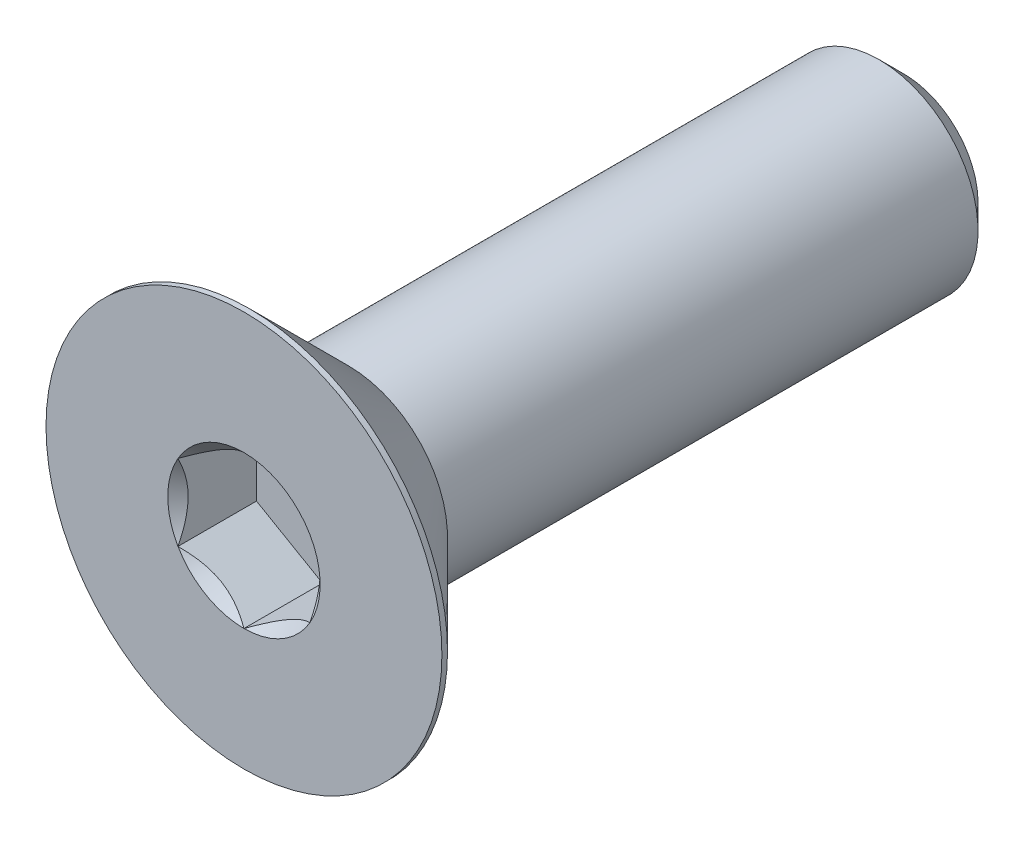
ISO-10303-21;
HEADER;
FILE_DESCRIPTION(('STEP AP214'),'2;1');
FILE_NAME('part.step','',(''),(''),'','','');
FILE_SCHEMA(('AUTOMOTIVE_DESIGN { 1 0 10303 214 1 1 1 1 }'));
ENDSEC;
DATA;
#1=APPLICATION_CONTEXT('core data for automotive mechanical design processes');
#2=APPLICATION_PROTOCOL_DEFINITION('international standard','automotive_design',2000,#1);
#3=PRODUCT_CONTEXT('',#1,'mechanical');
#4=PRODUCT('Part','Part','',(#3));
#5=PRODUCT_RELATED_PRODUCT_CATEGORY('part','',(#4));
#6=PRODUCT_DEFINITION_FORMATION('','',#4);
#7=PRODUCT_DEFINITION_CONTEXT('part definition',#1,'design');
#8=PRODUCT_DEFINITION('design','',#6,#7);
#9=PRODUCT_DEFINITION_SHAPE('','',#8);
#10=(LENGTH_UNIT() NAMED_UNIT(*) SI_UNIT(.MILLI.,.METRE.));
#11=(NAMED_UNIT(*) PLANE_ANGLE_UNIT() SI_UNIT($,.RADIAN.));
#12=(NAMED_UNIT(*) SI_UNIT($,.STERADIAN.) SOLID_ANGLE_UNIT());
#13=UNCERTAINTY_MEASURE_WITH_UNIT(LENGTH_MEASURE(1.E-05),#10,'distance_accuracy_value','');
#14=(GEOMETRIC_REPRESENTATION_CONTEXT(3) GLOBAL_UNCERTAINTY_ASSIGNED_CONTEXT((#13)) GLOBAL_UNIT_ASSIGNED_CONTEXT((#10,
#11,#12)) REPRESENTATION_CONTEXT('',''));
#15=CARTESIAN_POINT('',(0.,0.,0.));
#16=DIRECTION('',(0.,0.,1.));
#17=DIRECTION('',(1.,0.,0.));
#18=AXIS2_PLACEMENT_3D('',#15,#16,#17);
#19=CARTESIAN_POINT('',(0.,0.,4.915));
#20=DIRECTION('',(0.,0.,1.));
#21=DIRECTION('',(0.,-1.,0.));
#22=AXIS2_PLACEMENT_3D('',#19,#20,#21);
#23=CONICAL_SURFACE('',#22,3.,0.785398163397448);
#24=CARTESIAN_POINT('',(0.,0.,4.915));
#25=DIRECTION('',(0.,0.,1.));
#26=DIRECTION('',(0.,-1.,0.));
#27=AXIS2_PLACEMENT_3D('',#24,#25,#26);
#28=CIRCLE('',#27,3.);
#29=CARTESIAN_POINT('',(0.,-3.,4.915));
#30=VERTEX_POINT('',#29);
#31=EDGE_CURVE('E54',#30,#30,#28,.T.);
#32=ORIENTED_EDGE('',*,*,#31,.F.);
#33=EDGE_LOOP('',(#32));
#34=FACE_BOUND('',#33,.T.);
#35=CARTESIAN_POINT('',(0.,0.,3.41500000000001));
#36=DIRECTION('',(0.,0.,1.));
#37=DIRECTION('',(0.,-1.,0.));
#38=AXIS2_PLACEMENT_3D('',#35,#36,#37);
#39=CIRCLE('',#38,1.50000000000001);
#40=CARTESIAN_POINT('',(0.,-1.50000000000001,3.41500000000001));
#41=VERTEX_POINT('',#40);
#42=EDGE_CURVE('E49',#41,#41,#39,.T.);
#43=ORIENTED_EDGE('',*,*,#42,.T.);
#44=EDGE_LOOP('',(#43));
#45=FACE_BOUND('',#44,.T.);
#46=ADVANCED_FACE('F50',(#34,#45),#23,.T.);
#47=CARTESIAN_POINT('',(0.,0.,5.));
#48=DIRECTION('',(0.,0.,-1.));
#49=DIRECTION('',(0.,1.,0.));
#50=AXIS2_PLACEMENT_3D('',#47,#48,#49);
#51=PLANE('',#50);
#52=CARTESIAN_POINT('',(0.,0.,5.));
#53=DIRECTION('',(0.,0.,1.));
#54=DIRECTION('',(0.,-1.,0.));
#55=AXIS2_PLACEMENT_3D('',#52,#53,#54);
#56=CIRCLE('',#55,3.);
#57=CARTESIAN_POINT('',(0.,-3.,5.));
#58=VERTEX_POINT('',#57);
#59=EDGE_CURVE('E264',#58,#58,#56,.T.);
#60=ORIENTED_EDGE('',*,*,#59,.T.);
#61=EDGE_LOOP('',(#60));
#62=FACE_BOUND('',#61,.T.);
#63=CARTESIAN_POINT('',(0.,0.,5.));
#64=DIRECTION('',(0.,0.,-1.));
#65=DIRECTION('',(-1.,0.,0.));
#66=AXIS2_PLACEMENT_3D('',#63,#64,#65);
#67=CIRCLE('',#66,1.15470053837925);
#68=CARTESIAN_POINT('',(-1.,0.577350269189623,5.));
#69=VERTEX_POINT('',#68);
#70=CARTESIAN_POINT('',(0.,1.15470053837925,5.));
#71=VERTEX_POINT('',#70);
#72=EDGE_CURVE('E140',#69,#71,#67,.T.);
#73=ORIENTED_EDGE('',*,*,#72,.T.);
#74=CARTESIAN_POINT('',(1.,0.577350269189625,5.));
#75=VERTEX_POINT('',#74);
#76=EDGE_CURVE('E137',#71,#75,#67,.T.);
#77=ORIENTED_EDGE('',*,*,#76,.T.);
#78=CARTESIAN_POINT('',(1.,-0.577350269189626,5.));
#79=VERTEX_POINT('',#78);
#80=EDGE_CURVE('E107',#75,#79,#67,.T.);
#81=ORIENTED_EDGE('',*,*,#80,.T.);
#82=CARTESIAN_POINT('',(0.,-1.15470053837925,5.));
#83=VERTEX_POINT('',#82);
#84=EDGE_CURVE('E98',#79,#83,#67,.T.);
#85=ORIENTED_EDGE('',*,*,#84,.T.);
#86=CARTESIAN_POINT('',(-1.,-0.577350269189627,5.));
#87=VERTEX_POINT('',#86);
#88=EDGE_CURVE('E62',#83,#87,#67,.T.);
#89=ORIENTED_EDGE('',*,*,#88,.T.);
#90=EDGE_CURVE('E68',#87,#69,#67,.T.);
#91=ORIENTED_EDGE('',*,*,#90,.T.);
#92=EDGE_LOOP('',(#73,#77,#81,#85,#89,#91));
#93=FACE_BOUND('',#92,.T.);
#94=ADVANCED_FACE('F133',(#62,#93),#51,.F.);
#95=CARTESIAN_POINT('',(0.,0.,5.));
#96=DIRECTION('',(0.,0.,1.));
#97=DIRECTION('',(0.,-1.,0.));
#98=AXIS2_PLACEMENT_3D('',#95,#96,#97);
#99=CYLINDRICAL_SURFACE('',#98,3.);
#100=ORIENTED_EDGE('',*,*,#31,.T.);
#101=EDGE_LOOP('',(#100));
#102=FACE_BOUND('',#101,.T.);
#103=ORIENTED_EDGE('',*,*,#59,.F.);
#104=EDGE_LOOP('',(#103));
#105=FACE_BOUND('',#104,.T.);
#106=ADVANCED_FACE('F217',(#102,#105),#99,.T.);
#107=CARTESIAN_POINT('',(0.,0.,5.));
#108=DIRECTION('',(0.,0.,1.));
#109=DIRECTION('',(-1.,0.,0.));
#110=AXIS2_PLACEMENT_3D('',#107,#108,#109);
#111=CONICAL_SURFACE('',#110,1.15470053837925,0.78539816339745);
#112=CARTESIAN_POINT('',(1.,-1.15147208646462,5.37038567751387));
#113=CARTESIAN_POINT('',(1.,-1.12343447988552,5.34921991987372));
#114=CARTESIAN_POINT('',(1.,-1.09524064850697,5.32826169217592));
#115=CARTESIAN_POINT('',(1.,-1.03847715644377,5.28684602223563));
#116=CARTESIAN_POINT('',(1.,-1.00990740382975,5.26638870612366));
#117=CARTESIAN_POINT('',(1.,-0.92312089433348,5.20560479495451));
#118=CARTESIAN_POINT('',(1.,-0.864253173759063,5.1661922289614));
#119=CARTESIAN_POINT('',(1.,-0.740809858258048,5.08882066420021));
#120=CARTESIAN_POINT('',(1.,-0.67610025513781,5.05107303911435));
#121=CARTESIAN_POINT('',(1.,-0.543448939049126,4.9820245875513));
#122=CARTESIAN_POINT('',(1.,-0.475519112027781,4.95070202784687));
#123=CARTESIAN_POINT('',(1.,-0.37355585033353,4.9123817788838));
#124=CARTESIAN_POINT('',(1.,-0.341031989670909,4.90138359164216));
#125=CARTESIAN_POINT('',(1.,-0.275199079052294,4.88199834214736));
#126=CARTESIAN_POINT('',(1.,-0.241889975173934,4.8736114597767));
#127=CARTESIAN_POINT('',(1.,-0.175247517042993,4.86002522071902));
#128=CARTESIAN_POINT('',(1.,-0.141925568218175,4.85477079076797));
#129=CARTESIAN_POINT('',(1.,-0.0749144362322792,4.8475486865709));
#130=CARTESIAN_POINT('',(1.,-0.0412251978501618,4.84558151361051));
#131=CARTESIAN_POINT('',(1.,0.0249580992634212,4.84508319839316));
#132=CARTESIAN_POINT('',(1.,0.0574512826460395,4.84643026788864));
#133=CARTESIAN_POINT('',(1.,0.122148505701867,4.85221648449899));
#134=CARTESIAN_POINT('',(1.,0.154352610132927,4.85665492066154));
#135=CARTESIAN_POINT('',(1.,0.21879989886764,4.86845683014521));
#136=CARTESIAN_POINT('',(1.,0.251033743268954,4.87587054103851));
#137=CARTESIAN_POINT('',(1.,0.31479713235492,4.89322894249868));
#138=CARTESIAN_POINT('',(1.,0.346326735731005,4.90317342128883));
#139=CARTESIAN_POINT('',(1.,0.445594187730206,4.93822348255434));
#140=CARTESIAN_POINT('',(1.,0.511919139476037,4.96732085835673));
#141=CARTESIAN_POINT('',(1.,0.641453244657533,5.03201532968651));
#142=CARTESIAN_POINT('',(1.,0.704650133126345,5.06763577671525));
#143=CARTESIAN_POINT('',(1.,0.825428490174987,5.14112390134694));
#144=CARTESIAN_POINT('',(1.,0.883132947867686,5.17879194713547));
#145=CARTESIAN_POINT('',(1.,0.968148853704567,5.23702285294317));
#146=CARTESIAN_POINT('',(1.,0.996120570380286,5.25663847576286));
#147=CARTESIAN_POINT('',(1.,1.05168177729902,5.29638851706128));
#148=CARTESIAN_POINT('',(1.,1.079271369977,5.31652279219884));
#149=CARTESIAN_POINT('',(1.,1.10670185346329,5.33687211907298));
#150=B_SPLINE_CURVE_WITH_KNOTS('',3,(#112,#113,#114,#115,#116,#117,#118,#119,#120,#121,#122,
#123,#124,#125,#126,#127,#128,#129,#130,#131,#132,#133,#134,#135,#136,#137,#138,#139,#140,#141,
#142,#143,#144,#145,#146,#147,#148,#149),.UNSPECIFIED.,.F.,.F.,(4,2,2,2,2,2,2,2,2,2,2,2,2,2,2,2,
2,2,4),(0.,0.105386459083291,0.210799187330125,0.423233611565469,0.647793540908504,
0.871580877738612,0.974493074181424,1.07741235827201,1.17846428203205,1.27953161415763,
1.37694086739611,1.47432772585408,1.57343322804294,1.67253043972852,1.88917353996828,
2.10660791038813,2.31323734249844,2.41572589232045,2.51818641476504),.UNSPECIFIED.);
#151=EDGE_CURVE('E11',#75,#79,#150,.F.);
#152=ORIENTED_EDGE('',*,*,#151,.T.);
#153=ORIENTED_EDGE('',*,*,#80,.F.);
#154=EDGE_LOOP('',(#152,#153));
#155=FACE_BOUND('',#154,.T.);
#156=ADVANCED_FACE('F115',(#155),#111,.F.);
#157=CARTESIAN_POINT('',(-0.000199999999999349,1.15481600843309,5.00011548737262));
#158=CARTESIAN_POINT('',(0.0341825950071816,1.13496520795026,4.98027793082573));
#159=CARTESIAN_POINT('',(0.0691401181398258,1.11478247255942,4.96160502063889));
#160=CARTESIAN_POINT('',(0.140422802956091,1.07362739529219,4.92741474272316));
#161=CARTESIAN_POINT('',(0.176754750528985,1.0526511355808,4.91191640902346));
#162=CARTESIAN_POINT('',(0.250016613803312,1.01035337909803,4.88536730714227));
#163=CARTESIAN_POINT('',(0.286927851445415,0.989042666109241,4.87424977399693));
#164=CARTESIAN_POINT('',(0.36156272931086,0.945952199282691,4.85711986577618));
#165=CARTESIAN_POINT('',(0.399284088108636,0.924173762626597,4.85109469746668));
#166=CARTESIAN_POINT('',(0.464292198417934,0.886641312640015,4.8456605549675));
#167=CARTESIAN_POINT('',(0.491494371528173,0.870936130672276,4.84485693831673));
#168=CARTESIAN_POINT('',(0.545846040669112,0.839556179862849,4.84620669941689));
#169=CARTESIAN_POINT('',(0.572995523754876,0.823881418494924,4.8483607295472));
#170=CARTESIAN_POINT('',(0.654056277326961,0.777080970599367,4.85911697212847));
#171=CARTESIAN_POINT('',(0.707564140978428,0.74618819111643,4.87201455641536));
#172=CARTESIAN_POINT('',(0.801476065143433,0.69196811641965,4.90314073060218));
#173=CARTESIAN_POINT('',(0.842320523671835,0.668386557293372,4.91973779770184));
#174=CARTESIAN_POINT('',(0.922409637381945,0.622147085933681,4.9571249246853));
#175=CARTESIAN_POINT('',(0.961659010870439,0.599486449584575,4.97790134181741));
#176=CARTESIAN_POINT('',(1.0002,0.577234799135788,5.00011548737262));
#177=B_SPLINE_CURVE_WITH_KNOTS('',3,(#157,#158,#159,#160,#161,#162,#163,#164,#165,#166,#167,
#168,#169,#170,#171,#172,#173,#174,#175,#176),.UNSPECIFIED.,.F.,.F.,(4,2,2,2,2,2,2,2,2,4),(0.,
0.133237676828559,0.26725222983449,0.3991370762693,0.530689603280768,0.624814864263846,
0.718960890149133,0.907306626112097,1.05710100361789,1.20641411519286),.UNSPECIFIED.);
#178=EDGE_CURVE('E138',#71,#75,#177,.T.);
#179=ORIENTED_EDGE('',*,*,#178,.T.);
#180=ORIENTED_EDGE('',*,*,#76,.F.);
#181=EDGE_LOOP('',(#179,#180));
#182=FACE_BOUND('',#181,.T.);
#183=ADVANCED_FACE('F259',(#182),#111,.F.);
#184=CARTESIAN_POINT('',(-1.0002,0.577234799135787,5.00011548737262));
#185=CARTESIAN_POINT('',(-0.965817404992821,0.59708559961862,4.98027793082574));
#186=CARTESIAN_POINT('',(-0.930859881860177,0.617268335009455,4.96160502063889));
#187=CARTESIAN_POINT('',(-0.859577197043912,0.658423412276685,4.92741474272316));
#188=CARTESIAN_POINT('',(-0.823245249471017,0.679399671988079,4.91191640902346));
#189=CARTESIAN_POINT('',(-0.74998338619669,0.721697428470845,4.88536730714227));
#190=CARTESIAN_POINT('',(-0.713072148554587,0.743008141459636,4.87424977399693));
#191=CARTESIAN_POINT('',(-0.638437270689141,0.786098608286186,4.85711986577618));
#192=CARTESIAN_POINT('',(-0.600715911891365,0.80787704494228,4.85109469746668));
#193=CARTESIAN_POINT('',(-0.535707801582067,0.845409494928863,4.8456605549675));
#194=CARTESIAN_POINT('',(-0.508505628471828,0.861114676896602,4.84485693831673));
#195=CARTESIAN_POINT('',(-0.454153959330888,0.892494627706029,4.84620669941689));
#196=CARTESIAN_POINT('',(-0.427004476245125,0.908169389073954,4.8483607295472));
#197=CARTESIAN_POINT('',(-0.34594372267304,0.95496983696951,4.85911697212847));
#198=CARTESIAN_POINT('',(-0.292435859021573,0.985862616452447,4.87201455641536));
#199=CARTESIAN_POINT('',(-0.198523934856569,1.04008269114923,4.90314073060218));
#200=CARTESIAN_POINT('',(-0.157679476328166,1.06366425027551,4.91973779770184));
#201=CARTESIAN_POINT('',(-0.0775903626180558,1.1099037216352,4.9571249246853));
#202=CARTESIAN_POINT('',(-0.0383409891295616,1.1325643579843,4.97790134181741));
#203=CARTESIAN_POINT('',(0.000200000000000833,1.15481600843309,5.00011548737262));
#204=B_SPLINE_CURVE_WITH_KNOTS('',3,(#184,#185,#186,#187,#188,#189,#190,#191,#192,#193,#194,
#195,#196,#197,#198,#199,#200,#201,#202,#203),.UNSPECIFIED.,.F.,.F.,(4,2,2,2,2,2,2,2,2,4),(0.,
0.133237676828559,0.267252229834491,0.399137076269301,0.53068960328077,0.624814864263848,
0.718960890149135,0.907306626112099,1.0571010036179,1.20641411519286),.UNSPECIFIED.);
#205=EDGE_CURVE('E148',#69,#71,#204,.T.);
#206=ORIENTED_EDGE('',*,*,#205,.T.);
#207=ORIENTED_EDGE('',*,*,#72,.F.);
#208=EDGE_LOOP('',(#206,#207));
#209=FACE_BOUND('',#208,.T.);
#210=ADVANCED_FACE('F297',(#209),#111,.F.);
#211=CARTESIAN_POINT('',(-1.,-1.15147208646462,5.37038567751387));
#212=CARTESIAN_POINT('',(-1.,-1.12343447988552,5.34921991987372));
#213=CARTESIAN_POINT('',(-1.,-1.09524064850698,5.32826169217592));
#214=CARTESIAN_POINT('',(-1.,-1.03847715644377,5.28684602223563));
#215=CARTESIAN_POINT('',(-1.,-1.00990740382976,5.26638870612367));
#216=CARTESIAN_POINT('',(-1.,-0.923120894333482,5.20560479495452));
#217=CARTESIAN_POINT('',(-1.,-0.864253173759064,5.1661922289614));
#218=CARTESIAN_POINT('',(-1.,-0.74080985825805,5.08882066420021));
#219=CARTESIAN_POINT('',(-1.,-0.676100255137811,5.05107303911435));
#220=CARTESIAN_POINT('',(-1.,-0.543448939049127,4.9820245875513));
#221=CARTESIAN_POINT('',(-1.,-0.475519112027781,4.95070202784687));
#222=CARTESIAN_POINT('',(-1.,-0.373555850333531,4.9123817788838));
#223=CARTESIAN_POINT('',(-1.,-0.34103198967091,4.90138359164216));
#224=CARTESIAN_POINT('',(-1.,-0.275199079052295,4.88199834214736));
#225=CARTESIAN_POINT('',(-1.,-0.241889975173935,4.8736114597767));
#226=CARTESIAN_POINT('',(-1.,-0.175247517042994,4.86002522071902));
#227=CARTESIAN_POINT('',(-1.,-0.141925568218176,4.85477079076797));
#228=CARTESIAN_POINT('',(-1.,-0.0749144362322802,4.8475486865709));
#229=CARTESIAN_POINT('',(-1.,-0.041225197850163,4.84558151361051));
#230=CARTESIAN_POINT('',(-1.,0.0249580992634198,4.84508319839316));
#231=CARTESIAN_POINT('',(-1.,0.0574512826460382,4.84643026788864));
#232=CARTESIAN_POINT('',(-1.,0.122148505701866,4.85221648449899));
#233=CARTESIAN_POINT('',(-1.,0.154352610132925,4.85665492066154));
#234=CARTESIAN_POINT('',(-1.,0.218799898867639,4.86845683014521));
#235=CARTESIAN_POINT('',(-1.,0.251033743268953,4.87587054103851));
#236=CARTESIAN_POINT('',(-1.,0.314797132354919,4.89322894249868));
#237=CARTESIAN_POINT('',(-1.,0.346326735731004,4.90317342128883));
#238=CARTESIAN_POINT('',(-1.,0.445594187730205,4.93822348255434));
#239=CARTESIAN_POINT('',(-1.,0.511919139476036,4.96732085835673));
#240=CARTESIAN_POINT('',(-1.,0.641453244657532,5.03201532968651));
#241=CARTESIAN_POINT('',(-1.,0.704650133126344,5.06763577671524));
#242=CARTESIAN_POINT('',(-1.,0.825428490174986,5.14112390134694));
#243=CARTESIAN_POINT('',(-1.,0.883132947867684,5.17879194713547));
#244=CARTESIAN_POINT('',(-1.,0.968148853704565,5.23702285294317));
#245=CARTESIAN_POINT('',(-1.,0.996120570380285,5.25663847576286));
#246=CARTESIAN_POINT('',(-1.,1.05168177729901,5.29638851706127));
#247=CARTESIAN_POINT('',(-1.,1.079271369977,5.31652279219883));
#248=CARTESIAN_POINT('',(-1.,1.10670185346329,5.33687211907297));
#249=B_SPLINE_CURVE_WITH_KNOTS('',3,(#211,#212,#213,#214,#215,#216,#217,#218,#219,#220,#221,
#222,#223,#224,#225,#226,#227,#228,#229,#230,#231,#232,#233,#234,#235,#236,#237,#238,#239,#240,
#241,#242,#243,#244,#245,#246,#247,#248),.UNSPECIFIED.,.F.,.F.,(4,2,2,2,2,2,2,2,2,2,2,2,2,2,2,2,
2,2,4),(0.,0.105386459083291,0.210799187330125,0.423233611565471,0.647793540908507,
0.871580877738615,0.974493074181426,1.07741235827202,1.17846428203205,1.27953161415763,
1.37694086739611,1.47432772585408,1.57343322804294,1.67253043972852,1.88917353996828,
2.10660791038814,2.31323734249844,2.41572589232045,2.51818641476504),.UNSPECIFIED.);
#250=EDGE_CURVE('E177',#87,#69,#249,.T.);
#251=ORIENTED_EDGE('',*,*,#250,.T.);
#252=ORIENTED_EDGE('',*,*,#90,.F.);
#253=EDGE_LOOP('',(#251,#252));
#254=FACE_BOUND('',#253,.T.);
#255=ADVANCED_FACE('F301',(#254),#111,.F.);
#256=CARTESIAN_POINT('',(0.000199999999999969,-1.15481600843309,5.00011548737262));
#257=CARTESIAN_POINT('',(-0.0341825950071806,-1.13496520795026,4.98027793082574));
#258=CARTESIAN_POINT('',(-0.0691401181398248,-1.11478247255942,4.96160502063889));
#259=CARTESIAN_POINT('',(-0.14042280295609,-1.0736273952922,4.92741474272316));
#260=CARTESIAN_POINT('',(-0.176754750528985,-1.0526511355808,4.91191640902346));
#261=CARTESIAN_POINT('',(-0.250016613803312,-1.01035337909803,4.88536730714227));
#262=CARTESIAN_POINT('',(-0.286927851445415,-0.989042666109244,4.87424977399693));
#263=CARTESIAN_POINT('',(-0.36156272931086,-0.945952199282694,4.85711986577619));
#264=CARTESIAN_POINT('',(-0.399284088108637,-0.9241737626266,4.85109469746668));
#265=CARTESIAN_POINT('',(-0.464292198417935,-0.886641312640018,4.8456605549675));
#266=CARTESIAN_POINT('',(-0.491494371528173,-0.870936130672279,4.84485693831674));
#267=CARTESIAN_POINT('',(-0.545846040669113,-0.839556179862851,4.84620669941689));
#268=CARTESIAN_POINT('',(-0.572995523754877,-0.823881418494927,4.84836072954721));
#269=CARTESIAN_POINT('',(-0.654056277326962,-0.77708097059937,4.85911697212848));
#270=CARTESIAN_POINT('',(-0.707564140978429,-0.746188191116433,4.87201455641536));
#271=CARTESIAN_POINT('',(-0.801476065143434,-0.691968116419652,4.90314073060218));
#272=CARTESIAN_POINT('',(-0.842320523671836,-0.668386557293374,4.91973779770185));
#273=CARTESIAN_POINT('',(-0.922409637381945,-0.622147085933685,4.9571249246853));
#274=CARTESIAN_POINT('',(-0.961659010870439,-0.599486449584578,4.97790134181741));
#275=CARTESIAN_POINT('',(-1.0002,-0.577234799135791,5.00011548737262));
#276=B_SPLINE_CURVE_WITH_KNOTS('',3,(#256,#257,#258,#259,#260,#261,#262,#263,#264,#265,#266,
#267,#268,#269,#270,#271,#272,#273,#274,#275),.UNSPECIFIED.,.F.,.F.,(4,2,2,2,2,2,2,2,2,4),(0.,
0.133237676828559,0.267252229834491,0.399137076269301,0.530689603280769,0.624814864263847,
0.718960890149135,0.9073066261121,1.0571010036179,1.20641411519286),.UNSPECIFIED.);
#277=EDGE_CURVE('E122',#83,#87,#276,.T.);
#278=ORIENTED_EDGE('',*,*,#277,.T.);
#279=ORIENTED_EDGE('',*,*,#88,.F.);
#280=EDGE_LOOP('',(#278,#279));
#281=FACE_BOUND('',#280,.T.);
#282=ADVANCED_FACE('F163',(#281),#111,.F.);
#283=CARTESIAN_POINT('',(1.0002,-0.57723479913579,5.00011548737262));
#284=CARTESIAN_POINT('',(0.965817404992821,-0.597085599618624,4.98027793082574));
#285=CARTESIAN_POINT('',(0.930859881860177,-0.617268335009458,4.96160502063889));
#286=CARTESIAN_POINT('',(0.859577197043912,-0.658423412276688,4.92741474272316));
#287=CARTESIAN_POINT('',(0.823245249471018,-0.679399671988082,4.91191640902346));
#288=CARTESIAN_POINT('',(0.749983386196691,-0.721697428470849,4.88536730714227));
#289=CARTESIAN_POINT('',(0.713072148554588,-0.743008141459639,4.87424977399693));
#290=CARTESIAN_POINT('',(0.638437270689143,-0.786098608286188,4.85711986577619));
#291=CARTESIAN_POINT('',(0.600715911891366,-0.807877044942283,4.85109469746668));
#292=CARTESIAN_POINT('',(0.535707801582069,-0.845409494928865,4.8456605549675));
#293=CARTESIAN_POINT('',(0.50850562847183,-0.861114676896604,4.84485693831674));
#294=CARTESIAN_POINT('',(0.45415395933089,-0.892494627706031,4.84620669941689));
#295=CARTESIAN_POINT('',(0.427004476245126,-0.908169389073956,4.8483607295472));
#296=CARTESIAN_POINT('',(0.345943722673041,-0.954969836969514,4.85911697212848));
#297=CARTESIAN_POINT('',(0.292435859021574,-0.98586261645245,4.87201455641536));
#298=CARTESIAN_POINT('',(0.19852393485657,-1.04008269114923,4.90314073060218));
#299=CARTESIAN_POINT('',(0.157679476328167,-1.06366425027551,4.91973779770185));
#300=CARTESIAN_POINT('',(0.0775903626180568,-1.1099037216352,4.9571249246853));
#301=CARTESIAN_POINT('',(0.0383409891295625,-1.13256435798431,4.97790134181741));
#302=CARTESIAN_POINT('',(-0.0001999999999999,-1.15481600843309,5.00011548737262));
#303=B_SPLINE_CURVE_WITH_KNOTS('',3,(#283,#284,#285,#286,#287,#288,#289,#290,#291,#292,#293,
#294,#295,#296,#297,#298,#299,#300,#301,#302),.UNSPECIFIED.,.F.,.F.,(4,2,2,2,2,2,2,2,2,4),(0.,
0.133237676828559,0.26725222983449,0.3991370762693,0.530689603280768,0.624814864263846,
0.718960890149133,0.907306626112098,1.0571010036179,1.20641411519286),.UNSPECIFIED.);
#304=EDGE_CURVE('E101',#79,#83,#303,.T.);
#305=ORIENTED_EDGE('',*,*,#304,.T.);
#306=ORIENTED_EDGE('',*,*,#84,.F.);
#307=EDGE_LOOP('',(#305,#306));
#308=FACE_BOUND('',#307,.T.);
#309=ADVANCED_FACE('F103',(#308),#111,.F.);
#310=CARTESIAN_POINT('',(1.,-0.577350269189628,3.81));
#311=DIRECTION('',(0.,0.,1.));
#312=DIRECTION('',(1.,0.,0.));
#313=AXIS2_PLACEMENT_3D('',#310,#311,#312);
#314=PLANE('',#313);
#315=DIRECTION('',(0.866025403784438,0.5,0.));
#316=VECTOR('',#315,1.);
#317=CARTESIAN_POINT('',(0.,-1.15470053837926,3.81));
#318=LINE('',#317,#316);
#319=CARTESIAN_POINT('',(0.,-1.15470053837926,3.81));
#320=VERTEX_POINT('',#319);
#321=CARTESIAN_POINT('',(1.,-0.577350269189628,3.81));
#322=VERTEX_POINT('',#321);
#323=EDGE_CURVE('E123',#320,#322,#318,.T.);
#324=ORIENTED_EDGE('',*,*,#323,.T.);
#325=DIRECTION('',(0.,1.,0.));
#326=VECTOR('',#325,1.);
#327=CARTESIAN_POINT('',(1.,-0.577350269189628,3.81));
#328=LINE('',#327,#326);
#329=CARTESIAN_POINT('',(1.,0.577350269189625,3.81));
#330=VERTEX_POINT('',#329);
#331=EDGE_CURVE('E127',#322,#330,#328,.T.);
#332=ORIENTED_EDGE('',*,*,#331,.T.);
#333=DIRECTION('',(-0.866025403784439,0.5,0.));
#334=VECTOR('',#333,1.);
#335=CARTESIAN_POINT('',(1.,0.577350269189625,3.81));
#336=LINE('',#335,#334);
#337=CARTESIAN_POINT('',(0.,1.15470053837925,3.81));
#338=VERTEX_POINT('',#337);
#339=EDGE_CURVE('E287',#330,#338,#336,.T.);
#340=ORIENTED_EDGE('',*,*,#339,.T.);
#341=DIRECTION('',(-0.866025403784439,-0.5,0.));
#342=VECTOR('',#341,1.);
#343=CARTESIAN_POINT('',(0.,1.15470053837925,3.81));
#344=LINE('',#343,#342);
#345=CARTESIAN_POINT('',(-1.,0.577350269189625,3.81));
#346=VERTEX_POINT('',#345);
#347=EDGE_CURVE('E284',#338,#346,#344,.T.);
#348=ORIENTED_EDGE('',*,*,#347,.T.);
#349=DIRECTION('',(0.,-1.,0.));
#350=VECTOR('',#349,1.);
#351=CARTESIAN_POINT('',(-1.,0.577350269189625,3.81));
#352=LINE('',#351,#350);
#353=CARTESIAN_POINT('',(-1.,-0.577350269189629,3.81));
#354=VERTEX_POINT('',#353);
#355=EDGE_CURVE('E279',#346,#354,#352,.T.);
#356=ORIENTED_EDGE('',*,*,#355,.T.);
#357=DIRECTION('',(0.866025403784439,-0.5,0.));
#358=VECTOR('',#357,1.);
#359=CARTESIAN_POINT('',(-1.,-0.577350269189629,3.81));
#360=LINE('',#359,#358);
#361=EDGE_CURVE('E132',#354,#320,#360,.T.);
#362=ORIENTED_EDGE('',*,*,#361,.T.);
#363=EDGE_LOOP('',(#324,#332,#340,#348,#356,#362));
#364=FACE_BOUND('',#363,.T.);
#365=ADVANCED_FACE('F161',(#364),#314,.T.);
#366=CARTESIAN_POINT('',(1.,-0.577350269189628,3.81));
#367=DIRECTION('',(1.,0.,0.));
#368=DIRECTION('',(0.,1.,0.));
#369=AXIS2_PLACEMENT_3D('',#366,#367,#368);
#370=PLANE('',#369);
#371=ORIENTED_EDGE('',*,*,#151,.F.);
#372=DIRECTION('',(0.,0.,1.));
#373=VECTOR('',#372,1.);
#374=CARTESIAN_POINT('',(1.,0.577350269189625,3.81));
#375=LINE('',#374,#373);
#376=EDGE_CURVE('E129',#330,#75,#375,.T.);
#377=ORIENTED_EDGE('',*,*,#376,.F.);
#378=ORIENTED_EDGE('',*,*,#331,.F.);
#379=DIRECTION('',(0.,0.,1.));
#380=VECTOR('',#379,1.);
#381=CARTESIAN_POINT('',(1.,-0.577350269189628,3.81));
#382=LINE('',#381,#380);
#383=EDGE_CURVE('E119',#322,#79,#382,.T.);
#384=ORIENTED_EDGE('',*,*,#383,.T.);
#385=EDGE_LOOP('',(#371,#377,#378,#384));
#386=FACE_BOUND('',#385,.T.);
#387=ADVANCED_FACE('F126',(#386),#370,.F.);
#388=CARTESIAN_POINT('',(1.,0.577350269189625,3.81));
#389=DIRECTION('',(0.5,0.866025403784439,0.));
#390=DIRECTION('',(-0.866025403784439,0.5,0.));
#391=AXIS2_PLACEMENT_3D('',#388,#389,#390);
#392=PLANE('',#391);
#393=ORIENTED_EDGE('',*,*,#178,.F.);
#394=DIRECTION('',(0.,0.,1.));
#395=VECTOR('',#394,1.);
#396=CARTESIAN_POINT('',(0.,1.15470053837925,3.81));
#397=LINE('',#396,#395);
#398=EDGE_CURVE('E269',#338,#71,#397,.T.);
#399=ORIENTED_EDGE('',*,*,#398,.F.);
#400=ORIENTED_EDGE('',*,*,#339,.F.);
#401=ORIENTED_EDGE('',*,*,#376,.T.);
#402=EDGE_LOOP('',(#393,#399,#400,#401));
#403=FACE_BOUND('',#402,.T.);
#404=ADVANCED_FACE('F160',(#403),#392,.F.);
#405=CARTESIAN_POINT('',(0.,1.15470053837925,3.81));
#406=DIRECTION('',(-0.5,0.866025403784439,0.));
#407=DIRECTION('',(-0.866025403784439,-0.5,0.));
#408=AXIS2_PLACEMENT_3D('',#405,#406,#407);
#409=PLANE('',#408);
#410=ORIENTED_EDGE('',*,*,#205,.F.);
#411=DIRECTION('',(0.,0.,1.));
#412=VECTOR('',#411,1.);
#413=CARTESIAN_POINT('',(-1.,0.577350269189625,3.81));
#414=LINE('',#413,#412);
#415=EDGE_CURVE('E273',#346,#69,#414,.T.);
#416=ORIENTED_EDGE('',*,*,#415,.F.);
#417=ORIENTED_EDGE('',*,*,#347,.F.);
#418=ORIENTED_EDGE('',*,*,#398,.T.);
#419=EDGE_LOOP('',(#410,#416,#417,#418));
#420=FACE_BOUND('',#419,.T.);
#421=ADVANCED_FACE('F202',(#420),#409,.F.);
#422=CARTESIAN_POINT('',(-1.,0.577350269189625,3.81));
#423=DIRECTION('',(-1.,0.,0.));
#424=DIRECTION('',(0.,-1.,0.));
#425=AXIS2_PLACEMENT_3D('',#422,#423,#424);
#426=PLANE('',#425);
#427=ORIENTED_EDGE('',*,*,#250,.F.);
#428=DIRECTION('',(0.,0.,1.));
#429=VECTOR('',#428,1.);
#430=CARTESIAN_POINT('',(-1.,-0.577350269189629,3.81));
#431=LINE('',#430,#429);
#432=EDGE_CURVE('E266',#354,#87,#431,.T.);
#433=ORIENTED_EDGE('',*,*,#432,.F.);
#434=ORIENTED_EDGE('',*,*,#355,.F.);
#435=ORIENTED_EDGE('',*,*,#415,.T.);
#436=EDGE_LOOP('',(#427,#433,#434,#435));
#437=FACE_BOUND('',#436,.T.);
#438=ADVANCED_FACE('F197',(#437),#426,.F.);
#439=CARTESIAN_POINT('',(-1.,-0.577350269189629,3.81));
#440=DIRECTION('',(-0.5,-0.866025403784439,0.));
#441=DIRECTION('',(0.866025403784439,-0.5,0.));
#442=AXIS2_PLACEMENT_3D('',#439,#440,#441);
#443=PLANE('',#442);
#444=ORIENTED_EDGE('',*,*,#277,.F.);
#445=DIRECTION('',(0.,0.,1.));
#446=VECTOR('',#445,1.);
#447=CARTESIAN_POINT('',(0.,-1.15470053837926,3.81));
#448=LINE('',#447,#446);
#449=EDGE_CURVE('E125',#320,#83,#448,.T.);
#450=ORIENTED_EDGE('',*,*,#449,.F.);
#451=ORIENTED_EDGE('',*,*,#361,.F.);
#452=ORIENTED_EDGE('',*,*,#432,.T.);
#453=EDGE_LOOP('',(#444,#450,#451,#452));
#454=FACE_BOUND('',#453,.T.);
#455=ADVANCED_FACE('F196',(#454),#443,.F.);
#456=CARTESIAN_POINT('',(0.,-1.15470053837926,3.81));
#457=DIRECTION('',(0.5,-0.866025403784439,0.));
#458=DIRECTION('',(0.866025403784439,0.5,0.));
#459=AXIS2_PLACEMENT_3D('',#456,#457,#458);
#460=PLANE('',#459);
#461=ORIENTED_EDGE('',*,*,#304,.F.);
#462=ORIENTED_EDGE('',*,*,#383,.F.);
#463=ORIENTED_EDGE('',*,*,#323,.F.);
#464=ORIENTED_EDGE('',*,*,#449,.T.);
#465=EDGE_LOOP('',(#461,#462,#463,#464));
#466=FACE_BOUND('',#465,.T.);
#467=ADVANCED_FACE('F118',(#466),#460,.F.);
#468=CARTESIAN_POINT('',(0.,-1.5,-5.00000000000001));
#469=DIRECTION('',(0.,0.,1.));
#470=DIRECTION('',(0.,-1.,0.));
#471=AXIS2_PLACEMENT_3D('',#468,#469,#470);
#472=PLANE('',#471);
#473=CARTESIAN_POINT('',(0.,0.,-5.00000000000001));
#474=DIRECTION('',(0.,0.,1.));
#475=DIRECTION('',(0.,-1.,0.));
#476=AXIS2_PLACEMENT_3D('',#473,#474,#475);
#477=CIRCLE('',#476,1.125);
#478=CARTESIAN_POINT('',(0.,-1.125,-5.00000000000001));
#479=VERTEX_POINT('',#478);
#480=EDGE_CURVE('E141',#479,#479,#477,.F.);
#481=ORIENTED_EDGE('',*,*,#480,.T.);
#482=EDGE_LOOP('',(#481));
#483=FACE_BOUND('',#482,.T.);
#484=ADVANCED_FACE('F245',(#483),#472,.F.);
#485=CARTESIAN_POINT('',(0.,0.,3.81));
#486=DIRECTION('',(0.,0.,1.));
#487=DIRECTION('',(0.,-1.,0.));
#488=AXIS2_PLACEMENT_3D('',#485,#486,#487);
#489=CYLINDRICAL_SURFACE('',#488,1.50000000000001);
#490=ORIENTED_EDGE('',*,*,#42,.F.);
#491=EDGE_LOOP('',(#490));
#492=FACE_BOUND('',#491,.T.);
#493=CARTESIAN_POINT('',(0.,0.,-4.62500000000001));
#494=DIRECTION('',(0.,0.,1.));
#495=DIRECTION('',(0.,-1.,0.));
#496=AXIS2_PLACEMENT_3D('',#493,#494,#495);
#497=CIRCLE('',#496,1.50000000000001);
#498=CARTESIAN_POINT('',(0.,-1.50000000000001,-4.62500000000001));
#499=VERTEX_POINT('',#498);
#500=EDGE_CURVE('E227',#499,#499,#497,.T.);
#501=ORIENTED_EDGE('',*,*,#500,.T.);
#502=EDGE_LOOP('',(#501));
#503=FACE_BOUND('',#502,.T.);
#504=ADVANCED_FACE('F233',(#492,#503),#489,.T.);
#505=CARTESIAN_POINT('',(0.,0.,-4.62500000000001));
#506=DIRECTION('',(0.,0.,1.));
#507=DIRECTION('',(0.,-1.,0.));
#508=AXIS2_PLACEMENT_3D('',#505,#506,#507);
#509=CONICAL_SURFACE('',#508,1.50000000000001,0.785398163397452);
#510=ORIENTED_EDGE('',*,*,#480,.F.);
#511=EDGE_LOOP('',(#510));
#512=FACE_BOUND('',#511,.T.);
#513=ORIENTED_EDGE('',*,*,#500,.F.);
#514=EDGE_LOOP('',(#513));
#515=FACE_BOUND('',#514,.T.);
#516=ADVANCED_FACE('F166',(#512,#515),#509,.T.);
#517=CLOSED_SHELL('',(#46,#94,#106,#156,#183,#210,#255,#282,#309,#365,#387,#404,#421,#438,#455,
#467,#484,#504,#516));
#518=MANIFOLD_SOLID_BREP('B2',#517);
#519=ADVANCED_BREP_SHAPE_REPRESENTATION('',(#18,#518),#14);
#520=SHAPE_DEFINITION_REPRESENTATION(#9,#519);
ENDSEC;
END-ISO-10303-21;
